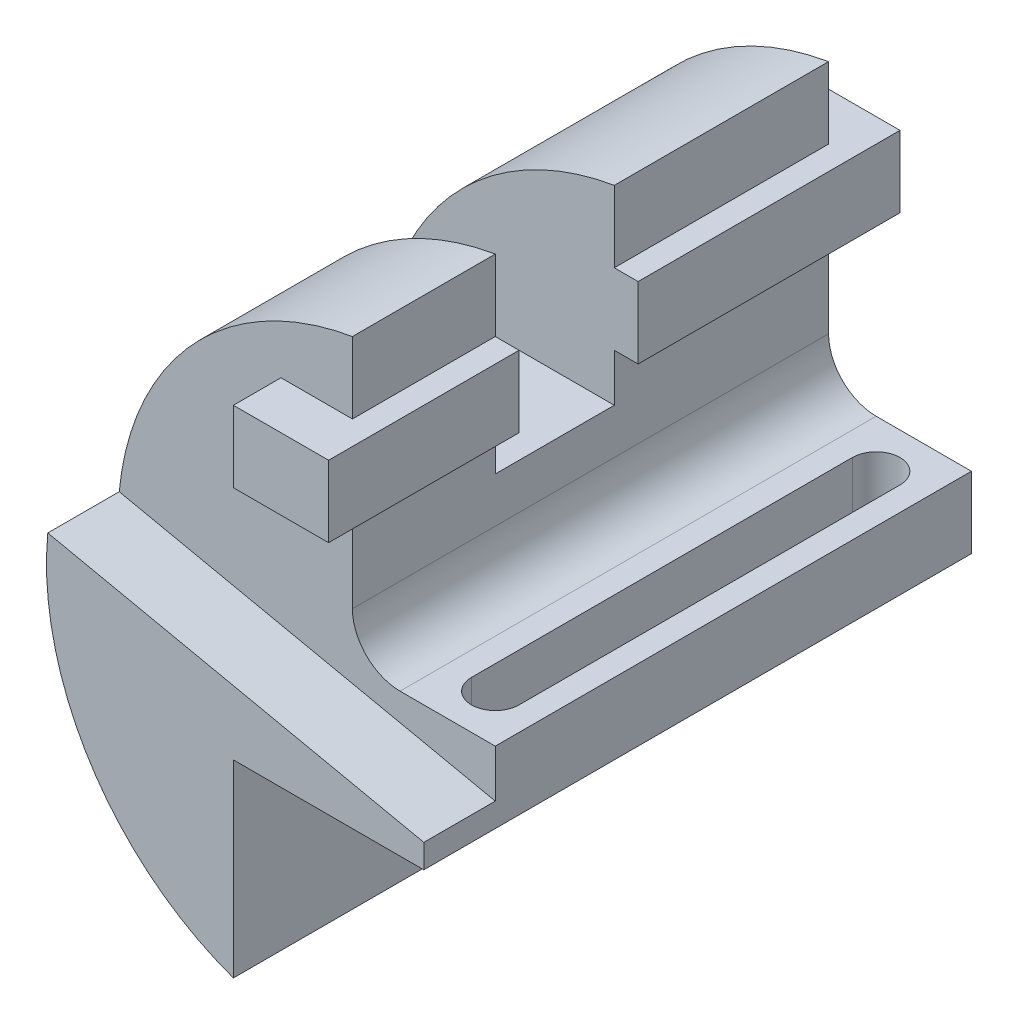
ISO-10303-21;
HEADER;
FILE_DESCRIPTION(('STEP AP214'),'2;1');
FILE_NAME('part.step','',(''),(''),'','','');
FILE_SCHEMA(('AUTOMOTIVE_DESIGN { 1 0 10303 214 1 1 1 1 }'));
ENDSEC;
DATA;
#1=APPLICATION_CONTEXT('core data for automotive mechanical design processes');
#2=APPLICATION_PROTOCOL_DEFINITION('international standard','automotive_design',2000,#1);
#3=PRODUCT_CONTEXT('',#1,'mechanical');
#4=PRODUCT('Part','Part','',(#3));
#5=PRODUCT_RELATED_PRODUCT_CATEGORY('part','',(#4));
#6=PRODUCT_DEFINITION_FORMATION('','',#4);
#7=PRODUCT_DEFINITION_CONTEXT('part definition',#1,'design');
#8=PRODUCT_DEFINITION('design','',#6,#7);
#9=PRODUCT_DEFINITION_SHAPE('','',#8);
#10=(LENGTH_UNIT() NAMED_UNIT(*) SI_UNIT(.MILLI.,.METRE.));
#11=(NAMED_UNIT(*) PLANE_ANGLE_UNIT() SI_UNIT($,.RADIAN.));
#12=(NAMED_UNIT(*) SI_UNIT($,.STERADIAN.) SOLID_ANGLE_UNIT());
#13=UNCERTAINTY_MEASURE_WITH_UNIT(LENGTH_MEASURE(1.E-05),#10,'distance_accuracy_value','');
#14=(GEOMETRIC_REPRESENTATION_CONTEXT(3) GLOBAL_UNCERTAINTY_ASSIGNED_CONTEXT((#13)) GLOBAL_UNIT_ASSIGNED_CONTEXT((#10,
#11,#12)) REPRESENTATION_CONTEXT('',''));
#15=CARTESIAN_POINT('',(0.,0.,0.));
#16=DIRECTION('',(0.,0.,1.));
#17=DIRECTION('',(1.,0.,0.));
#18=AXIS2_PLACEMENT_3D('',#15,#16,#17);
#19=CARTESIAN_POINT('',(-10.,58.4000214041057,115.));
#20=DIRECTION('',(-1.,0.,0.));
#21=DIRECTION('',(0.,-1.,0.));
#22=AXIS2_PLACEMENT_3D('',#19,#20,#21);
#23=PLANE('',#22);
#24=DIRECTION('',(0.,0.,-1.));
#25=VECTOR('',#24,1.);
#26=CARTESIAN_POINT('',(-10.,43.4000214041057,115.));
#27=LINE('',#26,#25);
#28=CARTESIAN_POINT('',(-9.99999999999999,43.4000214041057,100.));
#29=VERTEX_POINT('',#28);
#30=CARTESIAN_POINT('',(-9.99999999999999,43.4000214041057,70.));
#31=VERTEX_POINT('',#30);
#32=EDGE_CURVE('E370',#29,#31,#27,.T.);
#33=ORIENTED_EDGE('',*,*,#32,.T.);
#34=DIRECTION('',(0.,1.,0.));
#35=VECTOR('',#34,1.);
#36=CARTESIAN_POINT('',(-10.,58.4000214041057,70.));
#37=LINE('',#36,#35);
#38=CARTESIAN_POINT('',(-10.,58.4000214041057,70.));
#39=VERTEX_POINT('',#38);
#40=EDGE_CURVE('E301',#31,#39,#37,.T.);
#41=ORIENTED_EDGE('',*,*,#40,.T.);
#42=DIRECTION('',(0.,0.,-1.));
#43=VECTOR('',#42,1.);
#44=CARTESIAN_POINT('',(-10.,58.4000214041057,115.));
#45=LINE('',#44,#43);
#46=CARTESIAN_POINT('',(-9.99999999999999,58.4000214041057,100.));
#47=VERTEX_POINT('',#46);
#48=EDGE_CURVE('E452',#47,#39,#45,.T.);
#49=ORIENTED_EDGE('',*,*,#48,.F.);
#50=DIRECTION('',(0.,1.,0.));
#51=VECTOR('',#50,1.);
#52=CARTESIAN_POINT('',(-9.99999999999999,8.90002140410568,100.));
#53=LINE('',#52,#51);
#54=EDGE_CURVE('E390',#29,#47,#53,.T.);
#55=ORIENTED_EDGE('',*,*,#54,.F.);
#56=EDGE_LOOP('',(#33,#41,#49,#55));
#57=FACE_BOUND('',#56,.T.);
#58=ADVANCED_FACE('F44',(#57),#23,.F.);
#59=CARTESIAN_POINT('',(-25.,43.4000214041057,-45.));
#60=DIRECTION('',(0.,1.,0.));
#61=DIRECTION('',(0.,0.,1.));
#62=AXIS2_PLACEMENT_3D('',#59,#60,#61);
#63=PLANE('',#62);
#64=DIRECTION('',(1.,0.,0.));
#65=VECTOR('',#64,1.);
#66=CARTESIAN_POINT('',(-25.,43.4000214041057,70.));
#67=LINE('',#66,#65);
#68=CARTESIAN_POINT('',(-4.99999999999999,43.4000214041057,70.));
#69=VERTEX_POINT('',#68);
#70=EDGE_CURVE('E298',#31,#69,#67,.T.);
#71=ORIENTED_EDGE('',*,*,#70,.F.);
#72=ORIENTED_EDGE('',*,*,#32,.F.);
#73=DIRECTION('',(-1.,0.,0.));
#74=VECTOR('',#73,1.);
#75=CARTESIAN_POINT('',(0.,43.4000214041057,100.));
#76=LINE('',#75,#74);
#77=CARTESIAN_POINT('',(-25.,43.4000214041057,100.));
#78=VERTEX_POINT('',#77);
#79=EDGE_CURVE('E485',#29,#78,#76,.T.);
#80=ORIENTED_EDGE('',*,*,#79,.T.);
#81=DIRECTION('',(0.,0.,1.));
#82=VECTOR('',#81,1.);
#83=CARTESIAN_POINT('',(-25.,43.4000214041057,-45.));
#84=LINE('',#83,#82);
#85=CARTESIAN_POINT('',(-25.,43.4000214041057,110.));
#86=VERTEX_POINT('',#85);
#87=EDGE_CURVE('E344',#78,#86,#84,.T.);
#88=ORIENTED_EDGE('',*,*,#87,.T.);
#89=DIRECTION('',(-1.,0.,0.));
#90=VECTOR('',#89,1.);
#91=CARTESIAN_POINT('',(-25.,43.4000214041057,110.));
#92=LINE('',#91,#90);
#93=CARTESIAN_POINT('',(-4.99999999999999,43.4000214041057,110.));
#94=VERTEX_POINT('',#93);
#95=EDGE_CURVE('E336',#94,#86,#92,.T.);
#96=ORIENTED_EDGE('',*,*,#95,.F.);
#97=DIRECTION('',(0.,0.,1.));
#98=VECTOR('',#97,1.);
#99=CARTESIAN_POINT('',(-4.99999999999999,43.4000214041057,-45.));
#100=LINE('',#99,#98);
#101=EDGE_CURVE('E349',#69,#94,#100,.T.);
#102=ORIENTED_EDGE('',*,*,#101,.F.);
#103=EDGE_LOOP('',(#71,#72,#80,#88,#96,#102));
#104=FACE_BOUND('',#103,.T.);
#105=ADVANCED_FACE('F525',(#104),#63,.T.);
#106=CARTESIAN_POINT('',(-25.,28.4000214041057,-45.));
#107=DIRECTION('',(0.,-1.,0.));
#108=DIRECTION('',(0.,0.,-1.));
#109=AXIS2_PLACEMENT_3D('',#106,#107,#108);
#110=PLANE('',#109);
#111=DIRECTION('',(-1.,0.,0.));
#112=VECTOR('',#111,1.);
#113=CARTESIAN_POINT('',(-25.,28.4000214041057,70.));
#114=LINE('',#113,#112);
#115=CARTESIAN_POINT('',(-4.99999999999999,28.4000214041057,70.));
#116=VERTEX_POINT('',#115);
#117=CARTESIAN_POINT('',(-9.99999999999999,28.4000214041057,70.));
#118=VERTEX_POINT('',#117);
#119=EDGE_CURVE('E291',#116,#118,#114,.T.);
#120=ORIENTED_EDGE('',*,*,#119,.F.);
#121=DIRECTION('',(0.,0.,1.));
#122=VECTOR('',#121,1.);
#123=CARTESIAN_POINT('',(-4.99999999999999,28.4000214041057,-45.));
#124=LINE('',#123,#122);
#125=CARTESIAN_POINT('',(-4.99999999999999,28.4000214041057,110.));
#126=VERTEX_POINT('',#125);
#127=EDGE_CURVE('E354',#116,#126,#124,.T.);
#128=ORIENTED_EDGE('',*,*,#127,.T.);
#129=DIRECTION('',(1.,0.,0.));
#130=VECTOR('',#129,1.);
#131=CARTESIAN_POINT('',(-25.,28.4000214041057,110.));
#132=LINE('',#131,#130);
#133=CARTESIAN_POINT('',(-25.,28.4000214041057,110.));
#134=VERTEX_POINT('',#133);
#135=EDGE_CURVE('E328',#134,#126,#132,.T.);
#136=ORIENTED_EDGE('',*,*,#135,.F.);
#137=DIRECTION('',(0.,0.,1.));
#138=VECTOR('',#137,1.);
#139=CARTESIAN_POINT('',(-25.,28.4000214041057,-45.));
#140=LINE('',#139,#138);
#141=CARTESIAN_POINT('',(-25.,28.4000214041057,100.));
#142=VERTEX_POINT('',#141);
#143=EDGE_CURVE('E340',#142,#134,#140,.T.);
#144=ORIENTED_EDGE('',*,*,#143,.F.);
#145=DIRECTION('',(1.,0.,0.));
#146=VECTOR('',#145,1.);
#147=CARTESIAN_POINT('',(0.,28.4000214041057,100.));
#148=LINE('',#147,#146);
#149=CARTESIAN_POINT('',(-9.99999999999999,28.4000214041057,100.));
#150=VERTEX_POINT('',#149);
#151=EDGE_CURVE('E477',#142,#150,#148,.T.);
#152=ORIENTED_EDGE('',*,*,#151,.T.);
#153=DIRECTION('',(0.,0.,1.));
#154=VECTOR('',#153,1.);
#155=CARTESIAN_POINT('',(-9.99999999999999,28.4000214041057,115.));
#156=LINE('',#155,#154);
#157=EDGE_CURVE('E361',#118,#150,#156,.T.);
#158=ORIENTED_EDGE('',*,*,#157,.F.);
#159=EDGE_LOOP('',(#120,#128,#136,#144,#152,#158));
#160=FACE_BOUND('',#159,.T.);
#161=ADVANCED_FACE('F533',(#160),#110,.T.);
#162=CARTESIAN_POINT('',(-4.99999999999999,43.4000214041057,-45.));
#163=DIRECTION('',(1.,0.,0.));
#164=DIRECTION('',(0.,1.,0.));
#165=AXIS2_PLACEMENT_3D('',#162,#163,#164);
#166=PLANE('',#165);
#167=DIRECTION('',(0.,-1.,0.));
#168=VECTOR('',#167,1.);
#169=CARTESIAN_POINT('',(-4.99999999999999,43.4000214041057,70.));
#170=LINE('',#169,#168);
#171=EDGE_CURVE('E492',#69,#116,#170,.T.);
#172=ORIENTED_EDGE('',*,*,#171,.F.);
#173=ORIENTED_EDGE('',*,*,#101,.T.);
#174=DIRECTION('',(0.,1.,0.));
#175=VECTOR('',#174,1.);
#176=CARTESIAN_POINT('',(-4.99999999999999,43.4000214041057,110.));
#177=LINE('',#176,#175);
#178=EDGE_CURVE('E332',#126,#94,#177,.T.);
#179=ORIENTED_EDGE('',*,*,#178,.F.);
#180=ORIENTED_EDGE('',*,*,#127,.F.);
#181=EDGE_LOOP('',(#172,#173,#179,#180));
#182=FACE_BOUND('',#181,.T.);
#183=ADVANCED_FACE('F540',(#182),#166,.T.);
#184=CARTESIAN_POINT('',(-10.,58.4000214041057,45.));
#185=VERTEX_POINT('',#184);
#186=CARTESIAN_POINT('',(-10.,58.4000214041057,0.));
#187=VERTEX_POINT('',#186);
#188=EDGE_CURVE('E426',#185,#187,#45,.T.);
#189=ORIENTED_EDGE('',*,*,#188,.F.);
#190=DIRECTION('',(0.,-1.,0.));
#191=VECTOR('',#190,1.);
#192=CARTESIAN_POINT('',(-10.,58.4000214041057,45.));
#193=LINE('',#192,#191);
#194=CARTESIAN_POINT('',(-9.99999999999999,43.4000214041057,45.));
#195=VERTEX_POINT('',#194);
#196=EDGE_CURVE('E283',#185,#195,#193,.T.);
#197=ORIENTED_EDGE('',*,*,#196,.T.);
#198=CARTESIAN_POINT('',(-10.,43.4000214041057,0.));
#199=VERTEX_POINT('',#198);
#200=EDGE_CURVE('E369',#195,#199,#27,.T.);
#201=ORIENTED_EDGE('',*,*,#200,.T.);
#202=DIRECTION('',(0.,1.,0.));
#203=VECTOR('',#202,1.);
#204=CARTESIAN_POINT('',(-10.,58.4000214041057,0.));
#205=LINE('',#204,#203);
#206=EDGE_CURVE('E448',#199,#187,#205,.T.);
#207=ORIENTED_EDGE('',*,*,#206,.T.);
#208=EDGE_LOOP('',(#189,#197,#201,#207));
#209=FACE_BOUND('',#208,.T.);
#210=ADVANCED_FACE('F528',(#209),#23,.F.);
#211=CARTESIAN_POINT('',(0.,-1.09997859589433,115.));
#212=DIRECTION('',(0.,-1.,0.));
#213=DIRECTION('',(0.,0.,-1.));
#214=AXIS2_PLACEMENT_3D('',#211,#212,#213);
#215=PLANE('',#214);
#216=DIRECTION('',(0.,0.,1.));
#217=VECTOR('',#216,1.);
#218=CARTESIAN_POINT('',(5.00000000000004,-1.09997859589433,10.));
#219=LINE('',#218,#217);
#220=CARTESIAN_POINT('',(5.00000000000004,-1.09997859589433,10.));
#221=VERTEX_POINT('',#220);
#222=CARTESIAN_POINT('',(5.00000000000005,-1.09997859589433,90.));
#223=VERTEX_POINT('',#222);
#224=EDGE_CURVE('E243',#221,#223,#219,.T.);
#225=ORIENTED_EDGE('',*,*,#224,.F.);
#226=CARTESIAN_POINT('',(10.,-1.09997859589433,10.));
#227=DIRECTION('',(0.,1.,0.));
#228=DIRECTION('',(0.,0.,1.));
#229=AXIS2_PLACEMENT_3D('',#226,#227,#228);
#230=CIRCLE('',#229,5.);
#231=CARTESIAN_POINT('',(15.,-1.09997859589433,10.));
#232=VERTEX_POINT('',#231);
#233=EDGE_CURVE('E60',#232,#221,#230,.T.);
#234=ORIENTED_EDGE('',*,*,#233,.F.);
#235=DIRECTION('',(0.,0.,-1.));
#236=VECTOR('',#235,1.);
#237=CARTESIAN_POINT('',(15.,-1.09997859589433,10.));
#238=LINE('',#237,#236);
#239=CARTESIAN_POINT('',(15.,-1.09997859589433,90.));
#240=VERTEX_POINT('',#239);
#241=EDGE_CURVE('E251',#240,#232,#238,.T.);
#242=ORIENTED_EDGE('',*,*,#241,.F.);
#243=CARTESIAN_POINT('',(10.,-1.09997859589433,90.));
#244=DIRECTION('',(0.,1.,0.));
#245=DIRECTION('',(0.,0.,1.));
#246=AXIS2_PLACEMENT_3D('',#243,#244,#245);
#247=CIRCLE('',#246,4.99999999999999);
#248=EDGE_CURVE('E233',#223,#240,#247,.T.);
#249=ORIENTED_EDGE('',*,*,#248,.F.);
#250=EDGE_LOOP('',(#225,#234,#242,#249));
#251=FACE_BOUND('',#250,.T.);
#252=DIRECTION('',(-1.,0.,0.));
#253=VECTOR('',#252,1.);
#254=CARTESIAN_POINT('',(20.,-1.09997859589433,100.));
#255=LINE('',#254,#253);
#256=CARTESIAN_POINT('',(20.,-1.09997859589433,100.));
#257=VERTEX_POINT('',#256);
#258=CARTESIAN_POINT('',(0.,-1.09997859589433,100.));
#259=VERTEX_POINT('',#258);
#260=EDGE_CURVE('E384',#257,#259,#255,.T.);
#261=ORIENTED_EDGE('',*,*,#260,.F.);
#262=DIRECTION('',(0.,0.,-1.));
#263=VECTOR('',#262,1.);
#264=CARTESIAN_POINT('',(20.,-1.09997859589433,115.));
#265=LINE('',#264,#263);
#266=CARTESIAN_POINT('',(20.,-1.09997859589433,0.));
#267=VERTEX_POINT('',#266);
#268=EDGE_CURVE('E462',#257,#267,#265,.T.);
#269=ORIENTED_EDGE('',*,*,#268,.T.);
#270=DIRECTION('',(-1.,0.,0.));
#271=VECTOR('',#270,1.);
#272=CARTESIAN_POINT('',(0.,-1.09997859589433,0.));
#273=LINE('',#272,#271);
#274=CARTESIAN_POINT('',(0.,-1.09997859589433,0.));
#275=VERTEX_POINT('',#274);
#276=EDGE_CURVE('E440',#267,#275,#273,.T.);
#277=ORIENTED_EDGE('',*,*,#276,.T.);
#278=DIRECTION('',(0.,0.,-1.));
#279=VECTOR('',#278,1.);
#280=CARTESIAN_POINT('',(0.,-1.09997859589433,115.));
#281=LINE('',#280,#279);
#282=EDGE_CURVE('E459',#259,#275,#281,.T.);
#283=ORIENTED_EDGE('',*,*,#282,.F.);
#284=EDGE_LOOP('',(#261,#269,#277,#283));
#285=FACE_BOUND('',#284,.T.);
#286=ADVANCED_FACE('F248',(#251,#285),#215,.F.);
#287=CARTESIAN_POINT('',(0.,8.90002140410567,115.));
#288=DIRECTION('',(0.,0.,-1.));
#289=DIRECTION('',(-1.,0.,0.));
#290=AXIS2_PLACEMENT_3D('',#287,#288,#289);
#291=CYLINDRICAL_SURFACE('',#290,10.);
#292=CARTESIAN_POINT('',(0.,8.90002140410567,100.));
#293=DIRECTION('',(0.,0.,-1.));
#294=DIRECTION('',(1.,0.,0.));
#295=AXIS2_PLACEMENT_3D('',#292,#293,#294);
#296=CIRCLE('',#295,10.);
#297=CARTESIAN_POINT('',(-9.99999999999999,8.90002140410568,100.));
#298=VERTEX_POINT('',#297);
#299=EDGE_CURVE('E387',#259,#298,#296,.T.);
#300=ORIENTED_EDGE('',*,*,#299,.F.);
#301=ORIENTED_EDGE('',*,*,#282,.T.);
#302=CARTESIAN_POINT('',(0.,8.90002140410567,0.));
#303=DIRECTION('',(0.,0.,-1.));
#304=DIRECTION('',(1.,0.,0.));
#305=AXIS2_PLACEMENT_3D('',#302,#303,#304);
#306=CIRCLE('',#305,10.);
#307=CARTESIAN_POINT('',(-9.99999999999999,8.90002140410567,0.));
#308=VERTEX_POINT('',#307);
#309=EDGE_CURVE('E444',#275,#308,#306,.T.);
#310=ORIENTED_EDGE('',*,*,#309,.T.);
#311=DIRECTION('',(0.,0.,-1.));
#312=VECTOR('',#311,1.);
#313=CARTESIAN_POINT('',(-9.99999999999999,8.90002140410567,115.));
#314=LINE('',#313,#312);
#315=EDGE_CURVE('E456',#298,#308,#314,.T.);
#316=ORIENTED_EDGE('',*,*,#315,.F.);
#317=EDGE_LOOP('',(#300,#301,#310,#316));
#318=FACE_BOUND('',#317,.T.);
#319=ADVANCED_FACE('F543',(#318),#291,.F.);
#320=DIRECTION('',(0.,0.,1.));
#321=VECTOR('',#320,1.);
#322=CARTESIAN_POINT('',(-9.99999999999999,18.4000214041057,115.));
#323=LINE('',#322,#321);
#324=CARTESIAN_POINT('',(-9.99999999999999,18.4000214041057,45.));
#325=VERTEX_POINT('',#324);
#326=CARTESIAN_POINT('',(-9.99999999999999,18.4000214041057,70.));
#327=VERTEX_POINT('',#326);
#328=EDGE_CURVE('E309',#325,#327,#323,.T.);
#329=ORIENTED_EDGE('',*,*,#328,.T.);
#330=DIRECTION('',(0.,1.,0.));
#331=VECTOR('',#330,1.);
#332=CARTESIAN_POINT('',(-10.,58.4000214041057,70.));
#333=LINE('',#332,#331);
#334=EDGE_CURVE('E294',#327,#118,#333,.T.);
#335=ORIENTED_EDGE('',*,*,#334,.T.);
#336=ORIENTED_EDGE('',*,*,#157,.T.);
#337=EDGE_CURVE('E391',#298,#150,#53,.T.);
#338=ORIENTED_EDGE('',*,*,#337,.F.);
#339=ORIENTED_EDGE('',*,*,#315,.T.);
#340=CARTESIAN_POINT('',(-9.99999999999999,28.4000214041057,0.));
#341=VERTEX_POINT('',#340);
#342=EDGE_CURVE('E416',#308,#341,#205,.T.);
#343=ORIENTED_EDGE('',*,*,#342,.T.);
#344=CARTESIAN_POINT('',(-9.99999999999999,28.4000214041057,45.));
#345=VERTEX_POINT('',#344);
#346=EDGE_CURVE('E362',#341,#345,#156,.T.);
#347=ORIENTED_EDGE('',*,*,#346,.T.);
#348=DIRECTION('',(0.,-1.,0.));
#349=VECTOR('',#348,1.);
#350=CARTESIAN_POINT('',(-10.,58.4000214041057,45.));
#351=LINE('',#350,#349);
#352=EDGE_CURVE('E276',#345,#325,#351,.T.);
#353=ORIENTED_EDGE('',*,*,#352,.T.);
#354=EDGE_LOOP('',(#329,#335,#336,#338,#339,#343,#347,#353));
#355=FACE_BOUND('',#354,.T.);
#356=ADVANCED_FACE('F529',(#355),#23,.F.);
#357=CARTESIAN_POINT('',(0.,0.,115.));
#358=DIRECTION('',(0.,0.,-1.));
#359=DIRECTION('',(-1.,0.,0.));
#360=AXIS2_PLACEMENT_3D('',#357,#358,#359);
#361=CYLINDRICAL_SURFACE('',#360,59.25);
#362=ORIENTED_EDGE('',*,*,#48,.T.);
#363=CARTESIAN_POINT('',(0.,0.,70.));
#364=DIRECTION('',(0.,0.,1.));
#365=DIRECTION('',(0.,-1.,0.));
#366=AXIS2_PLACEMENT_3D('',#363,#364,#365);
#367=CIRCLE('',#366,59.25);
#368=CARTESIAN_POINT('',(-56.3205265629544,18.4000214041056,70.));
#369=VERTEX_POINT('',#368);
#370=EDGE_CURVE('E305',#39,#369,#367,.T.);
#371=ORIENTED_EDGE('',*,*,#370,.T.);
#372=DIRECTION('',(0.,0.,-1.));
#373=VECTOR('',#372,1.);
#374=CARTESIAN_POINT('',(-56.3205265629544,18.4000214041056,115.));
#375=LINE('',#374,#373);
#376=CARTESIAN_POINT('',(-56.3205265629544,18.4000214041056,45.));
#377=VERTEX_POINT('',#376);
#378=EDGE_CURVE('E495',#369,#377,#375,.T.);
#379=ORIENTED_EDGE('',*,*,#378,.T.);
#380=CARTESIAN_POINT('',(0.,0.,45.));
#381=DIRECTION('',(0.,0.,-1.));
#382=DIRECTION('',(0.,1.,0.));
#383=AXIS2_PLACEMENT_3D('',#380,#381,#382);
#384=CIRCLE('',#383,59.25);
#385=EDGE_CURVE('E287',#377,#185,#384,.T.);
#386=ORIENTED_EDGE('',*,*,#385,.T.);
#387=ORIENTED_EDGE('',*,*,#188,.T.);
#388=CARTESIAN_POINT('',(0.,0.,0.));
#389=DIRECTION('',(0.,0.,1.));
#390=DIRECTION('',(1.,0.,0.));
#391=AXIS2_PLACEMENT_3D('',#388,#389,#390);
#392=CIRCLE('',#391,59.25);
#393=CARTESIAN_POINT('',(-20.,-55.7724170177338,0.));
#394=VERTEX_POINT('',#393);
#395=EDGE_CURVE('E409',#187,#394,#392,.T.);
#396=ORIENTED_EDGE('',*,*,#395,.T.);
#397=DIRECTION('',(0.,0.,-1.));
#398=VECTOR('',#397,1.);
#399=CARTESIAN_POINT('',(-20.,-55.7724170177338,115.));
#400=LINE('',#399,#398);
#401=CARTESIAN_POINT('',(-20.,-55.7724170177338,115.));
#402=VERTEX_POINT('',#401);
#403=EDGE_CURVE('E473',#402,#394,#400,.T.);
#404=ORIENTED_EDGE('',*,*,#403,.F.);
#405=CARTESIAN_POINT('',(0.,0.,115.));
#406=DIRECTION('',(0.,0.,1.));
#407=DIRECTION('',(1.,0.,0.));
#408=AXIS2_PLACEMENT_3D('',#405,#406,#407);
#409=CIRCLE('',#408,59.25);
#410=CARTESIAN_POINT('',(-58.9764421708089,5.68698240486387,115.));
#411=VERTEX_POINT('',#410);
#412=EDGE_CURVE('E412',#411,#402,#409,.T.);
#413=ORIENTED_EDGE('',*,*,#412,.F.);
#414=DIRECTION('',(0.,0.,1.));
#415=VECTOR('',#414,1.);
#416=CARTESIAN_POINT('',(-58.9764421708089,5.68698240486387,100.));
#417=LINE('',#416,#415);
#418=CARTESIAN_POINT('',(-58.9764421708089,5.68698240486387,100.));
#419=VERTEX_POINT('',#418);
#420=EDGE_CURVE('E402',#419,#411,#417,.T.);
#421=ORIENTED_EDGE('',*,*,#420,.F.);
#422=CARTESIAN_POINT('',(0.,0.,100.));
#423=DIRECTION('',(0.,0.,1.));
#424=DIRECTION('',(1.,0.,0.));
#425=AXIS2_PLACEMENT_3D('',#422,#423,#424);
#426=CIRCLE('',#425,59.25);
#427=EDGE_CURVE('E395',#47,#419,#426,.T.);
#428=ORIENTED_EDGE('',*,*,#427,.F.);
#429=EDGE_LOOP('',(#362,#371,#379,#386,#387,#396,#404,#413,#421,#428));
#430=FACE_BOUND('',#429,.T.);
#431=ADVANCED_FACE('F46',(#430),#361,.T.);
#432=CARTESIAN_POINT('',(-20.,-16.0999785958943,115.));
#433=DIRECTION('',(-1.,0.,0.));
#434=DIRECTION('',(0.,-1.,0.));
#435=AXIS2_PLACEMENT_3D('',#432,#433,#434);
#436=PLANE('',#435);
#437=DIRECTION('',(0.,1.,0.));
#438=VECTOR('',#437,1.);
#439=CARTESIAN_POINT('',(-20.,-16.0999785958943,0.));
#440=LINE('',#439,#438);
#441=CARTESIAN_POINT('',(-20.,-16.0999785958943,0.));
#442=VERTEX_POINT('',#441);
#443=EDGE_CURVE('E430',#394,#442,#440,.T.);
#444=ORIENTED_EDGE('',*,*,#443,.T.);
#445=DIRECTION('',(0.,0.,-1.));
#446=VECTOR('',#445,1.);
#447=CARTESIAN_POINT('',(-20.,-16.0999785958943,115.));
#448=LINE('',#447,#446);
#449=CARTESIAN_POINT('',(-20.,-16.0999785958943,115.));
#450=VERTEX_POINT('',#449);
#451=EDGE_CURVE('E469',#450,#442,#448,.T.);
#452=ORIENTED_EDGE('',*,*,#451,.F.);
#453=DIRECTION('',(0.,1.,0.));
#454=VECTOR('',#453,1.);
#455=CARTESIAN_POINT('',(-20.,-16.0999785958943,115.));
#456=LINE('',#455,#454);
#457=EDGE_CURVE('E415',#402,#450,#456,.T.);
#458=ORIENTED_EDGE('',*,*,#457,.F.);
#459=ORIENTED_EDGE('',*,*,#403,.T.);
#460=EDGE_LOOP('',(#444,#452,#458,#459));
#461=FACE_BOUND('',#460,.T.);
#462=ADVANCED_FACE('F549',(#461),#436,.F.);
#463=CARTESIAN_POINT('',(20.,-16.0999785958943,115.));
#464=DIRECTION('',(0.,1.,0.));
#465=DIRECTION('',(-1.,0.,0.));
#466=AXIS2_PLACEMENT_3D('',#463,#464,#465);
#467=PLANE('',#466);
#468=DIRECTION('',(0.,0.,-1.));
#469=VECTOR('',#468,1.);
#470=CARTESIAN_POINT('',(15.,-16.0999785958943,115.));
#471=LINE('',#470,#469);
#472=CARTESIAN_POINT('',(15.,-16.0999785958943,90.));
#473=VERTEX_POINT('',#472);
#474=CARTESIAN_POINT('',(15.,-16.0999785958943,10.));
#475=VERTEX_POINT('',#474);
#476=EDGE_CURVE('E53',#473,#475,#471,.T.);
#477=ORIENTED_EDGE('',*,*,#476,.T.);
#478=CARTESIAN_POINT('',(10.,-16.0999785958943,10.));
#479=DIRECTION('',(0.,1.,0.));
#480=DIRECTION('',(-1.,0.,0.));
#481=AXIS2_PLACEMENT_3D('',#478,#479,#480);
#482=CIRCLE('',#481,5.);
#483=CARTESIAN_POINT('',(5.00000000000004,-16.0999785958943,10.));
#484=VERTEX_POINT('',#483);
#485=EDGE_CURVE('E12',#475,#484,#482,.T.);
#486=ORIENTED_EDGE('',*,*,#485,.T.);
#487=DIRECTION('',(0.,0.,1.));
#488=VECTOR('',#487,1.);
#489=CARTESIAN_POINT('',(5.00000000000005,-16.0999785958943,115.));
#490=LINE('',#489,#488);
#491=CARTESIAN_POINT('',(5.00000000000005,-16.0999785958943,90.));
#492=VERTEX_POINT('',#491);
#493=EDGE_CURVE('E499',#484,#492,#490,.T.);
#494=ORIENTED_EDGE('',*,*,#493,.T.);
#495=CARTESIAN_POINT('',(10.,-16.0999785958943,90.));
#496=DIRECTION('',(0.,1.,0.));
#497=DIRECTION('',(-1.,0.,0.));
#498=AXIS2_PLACEMENT_3D('',#495,#496,#497);
#499=CIRCLE('',#498,4.99999999999999);
#500=EDGE_CURVE('E236',#492,#473,#499,.T.);
#501=ORIENTED_EDGE('',*,*,#500,.T.);
#502=EDGE_LOOP('',(#477,#486,#494,#501));
#503=FACE_BOUND('',#502,.T.);
#504=DIRECTION('',(1.,0.,0.));
#505=VECTOR('',#504,1.);
#506=CARTESIAN_POINT('',(20.,-16.0999785958943,0.));
#507=LINE('',#506,#505);
#508=CARTESIAN_POINT('',(20.,-16.0999785958943,0.));
#509=VERTEX_POINT('',#508);
#510=EDGE_CURVE('E433',#442,#509,#507,.T.);
#511=ORIENTED_EDGE('',*,*,#510,.T.);
#512=DIRECTION('',(0.,0.,-1.));
#513=VECTOR('',#512,1.);
#514=CARTESIAN_POINT('',(20.,-16.0999785958943,115.));
#515=LINE('',#514,#513);
#516=CARTESIAN_POINT('',(20.,-16.0999785958943,115.));
#517=VERTEX_POINT('',#516);
#518=EDGE_CURVE('E465',#517,#509,#515,.T.);
#519=ORIENTED_EDGE('',*,*,#518,.F.);
#520=DIRECTION('',(1.,0.,0.));
#521=VECTOR('',#520,1.);
#522=CARTESIAN_POINT('',(20.,-16.0999785958943,115.));
#523=LINE('',#522,#521);
#524=EDGE_CURVE('E419',#450,#517,#523,.T.);
#525=ORIENTED_EDGE('',*,*,#524,.F.);
#526=ORIENTED_EDGE('',*,*,#451,.T.);
#527=EDGE_LOOP('',(#511,#519,#525,#526));
#528=FACE_BOUND('',#527,.T.);
#529=ADVANCED_FACE('F506',(#503,#528),#467,.F.);
#530=CARTESIAN_POINT('',(20.,-1.09997859589433,115.));
#531=DIRECTION('',(-1.,0.,0.));
#532=DIRECTION('',(0.,-1.,0.));
#533=AXIS2_PLACEMENT_3D('',#530,#531,#532);
#534=PLANE('',#533);
#535=DIRECTION('',(0.,1.,0.));
#536=VECTOR('',#535,1.);
#537=CARTESIAN_POINT('',(20.,-11.0999785958943,100.));
#538=LINE('',#537,#536);
#539=CARTESIAN_POINT('',(20.,-11.0999785958943,100.));
#540=VERTEX_POINT('',#539);
#541=EDGE_CURVE('E381',#540,#257,#538,.T.);
#542=ORIENTED_EDGE('',*,*,#541,.F.);
#543=DIRECTION('',(0.,0.,1.));
#544=VECTOR('',#543,1.);
#545=CARTESIAN_POINT('',(20.,-11.0999785958943,100.));
#546=LINE('',#545,#544);
#547=CARTESIAN_POINT('',(20.,-11.0999785958943,115.));
#548=VERTEX_POINT('',#547);
#549=EDGE_CURVE('E405',#540,#548,#546,.T.);
#550=ORIENTED_EDGE('',*,*,#549,.T.);
#551=DIRECTION('',(0.,1.,0.));
#552=VECTOR('',#551,1.);
#553=CARTESIAN_POINT('',(20.,-1.09997859589433,115.));
#554=LINE('',#553,#552);
#555=EDGE_CURVE('E422',#517,#548,#554,.T.);
#556=ORIENTED_EDGE('',*,*,#555,.F.);
#557=ORIENTED_EDGE('',*,*,#518,.T.);
#558=DIRECTION('',(0.,1.,0.));
#559=VECTOR('',#558,1.);
#560=CARTESIAN_POINT('',(20.,-1.09997859589433,0.));
#561=LINE('',#560,#559);
#562=EDGE_CURVE('E436',#509,#267,#561,.T.);
#563=ORIENTED_EDGE('',*,*,#562,.T.);
#564=ORIENTED_EDGE('',*,*,#268,.F.);
#565=EDGE_LOOP('',(#542,#550,#556,#557,#563,#564));
#566=FACE_BOUND('',#565,.T.);
#567=ADVANCED_FACE('F602',(#566),#534,.F.);
#568=CARTESIAN_POINT('',(0.,0.,115.));
#569=DIRECTION('',(0.,0.,1.));
#570=DIRECTION('',(1.,0.,0.));
#571=AXIS2_PLACEMENT_3D('',#568,#569,#570);
#572=PLANE('',#571);
#573=DIRECTION('',(0.978147600733806,-0.207911690817756,0.));
#574=VECTOR('',#573,1.);
#575=CARTESIAN_POINT('',(20.,-11.0999785958943,115.));
#576=LINE('',#575,#574);
#577=EDGE_CURVE('E380',#411,#548,#576,.T.);
#578=ORIENTED_EDGE('',*,*,#577,.F.);
#579=ORIENTED_EDGE('',*,*,#412,.T.);
#580=ORIENTED_EDGE('',*,*,#457,.T.);
#581=ORIENTED_EDGE('',*,*,#524,.T.);
#582=ORIENTED_EDGE('',*,*,#555,.T.);
#583=EDGE_LOOP('',(#578,#579,#580,#581,#582));
#584=FACE_BOUND('',#583,.T.);
#585=ADVANCED_FACE('F605',(#584),#572,.T.);
#586=CARTESIAN_POINT('',(0.,0.,0.));
#587=DIRECTION('',(0.,0.,1.));
#588=DIRECTION('',(1.,0.,0.));
#589=AXIS2_PLACEMENT_3D('',#586,#587,#588);
#590=PLANE('',#589);
#591=ORIENTED_EDGE('',*,*,#206,.F.);
#592=DIRECTION('',(-1.,0.,0.));
#593=VECTOR('',#592,1.);
#594=CARTESIAN_POINT('',(0.,43.4000214041057,0.));
#595=LINE('',#594,#593);
#596=CARTESIAN_POINT('',(-25.,43.4000214041057,0.));
#597=VERTEX_POINT('',#596);
#598=EDGE_CURVE('E374',#199,#597,#595,.T.);
#599=ORIENTED_EDGE('',*,*,#598,.T.);
#600=DIRECTION('',(0.,-1.,0.));
#601=VECTOR('',#600,1.);
#602=CARTESIAN_POINT('',(-25.,0.,0.));
#603=LINE('',#602,#601);
#604=CARTESIAN_POINT('',(-25.,28.4000214041057,0.));
#605=VERTEX_POINT('',#604);
#606=EDGE_CURVE('E377',#597,#605,#603,.T.);
#607=ORIENTED_EDGE('',*,*,#606,.T.);
#608=DIRECTION('',(1.,0.,0.));
#609=VECTOR('',#608,1.);
#610=CARTESIAN_POINT('',(0.,28.4000214041057,0.));
#611=LINE('',#610,#609);
#612=EDGE_CURVE('E366',#605,#341,#611,.T.);
#613=ORIENTED_EDGE('',*,*,#612,.T.);
#614=ORIENTED_EDGE('',*,*,#342,.F.);
#615=ORIENTED_EDGE('',*,*,#309,.F.);
#616=ORIENTED_EDGE('',*,*,#276,.F.);
#617=ORIENTED_EDGE('',*,*,#562,.F.);
#618=ORIENTED_EDGE('',*,*,#510,.F.);
#619=ORIENTED_EDGE('',*,*,#443,.F.);
#620=ORIENTED_EDGE('',*,*,#395,.F.);
#621=EDGE_LOOP('',(#591,#599,#607,#613,#614,#615,#616,#617,#618,#619,#620));
#622=FACE_BOUND('',#621,.T.);
#623=ADVANCED_FACE('F614',(#622),#590,.F.);
#624=CARTESIAN_POINT('',(20.,-11.0999785958943,100.));
#625=DIRECTION('',(-0.207911690817756,-0.978147600733806,0.));
#626=DIRECTION('',(0.978147600733806,-0.207911690817756,0.));
#627=AXIS2_PLACEMENT_3D('',#624,#625,#626);
#628=PLANE('',#627);
#629=ORIENTED_EDGE('',*,*,#577,.T.);
#630=ORIENTED_EDGE('',*,*,#549,.F.);
#631=DIRECTION('',(0.978147600733806,-0.207911690817756,0.));
#632=VECTOR('',#631,1.);
#633=CARTESIAN_POINT('',(20.,-11.0999785958943,100.));
#634=LINE('',#633,#632);
#635=EDGE_CURVE('E398',#419,#540,#634,.T.);
#636=ORIENTED_EDGE('',*,*,#635,.F.);
#637=ORIENTED_EDGE('',*,*,#420,.T.);
#638=EDGE_LOOP('',(#629,#630,#636,#637));
#639=FACE_BOUND('',#638,.T.);
#640=ADVANCED_FACE('F598',(#639),#628,.F.);
#641=CARTESIAN_POINT('',(0.,8.90002140410567,100.));
#642=DIRECTION('',(0.,0.,1.));
#643=DIRECTION('',(1.,0.,0.));
#644=AXIS2_PLACEMENT_3D('',#641,#642,#643);
#645=PLANE('',#644);
#646=ORIENTED_EDGE('',*,*,#79,.F.);
#647=ORIENTED_EDGE('',*,*,#54,.T.);
#648=ORIENTED_EDGE('',*,*,#427,.T.);
#649=ORIENTED_EDGE('',*,*,#635,.T.);
#650=ORIENTED_EDGE('',*,*,#541,.T.);
#651=ORIENTED_EDGE('',*,*,#260,.T.);
#652=ORIENTED_EDGE('',*,*,#299,.T.);
#653=ORIENTED_EDGE('',*,*,#337,.T.);
#654=ORIENTED_EDGE('',*,*,#151,.F.);
#655=DIRECTION('',(0.,-1.,0.));
#656=VECTOR('',#655,1.);
#657=CARTESIAN_POINT('',(-25.,8.90002140410567,100.));
#658=LINE('',#657,#656);
#659=EDGE_CURVE('E481',#78,#142,#658,.T.);
#660=ORIENTED_EDGE('',*,*,#659,.F.);
#661=EDGE_LOOP('',(#646,#647,#648,#649,#650,#651,#652,#653,#654,#660));
#662=FACE_BOUND('',#661,.T.);
#663=ADVANCED_FACE('F590',(#662),#645,.T.);
#664=CARTESIAN_POINT('',(-25.,43.4000214041057,-45.));
#665=DIRECTION('',(-1.,0.,0.));
#666=DIRECTION('',(0.,-1.,0.));
#667=AXIS2_PLACEMENT_3D('',#664,#665,#666);
#668=PLANE('',#667);
#669=ORIENTED_EDGE('',*,*,#606,.F.);
#670=CARTESIAN_POINT('',(-25.,43.4000214041057,-10.));
#671=VERTEX_POINT('',#670);
#672=EDGE_CURVE('E318',#671,#597,#84,.T.);
#673=ORIENTED_EDGE('',*,*,#672,.F.);
#674=DIRECTION('',(0.,1.,0.));
#675=VECTOR('',#674,1.);
#676=CARTESIAN_POINT('',(-25.,43.4000214041057,-10.));
#677=LINE('',#676,#675);
#678=CARTESIAN_POINT('',(-25.,28.4000214041057,-10.));
#679=VERTEX_POINT('',#678);
#680=EDGE_CURVE('E321',#679,#671,#677,.T.);
#681=ORIENTED_EDGE('',*,*,#680,.F.);
#682=EDGE_CURVE('E355',#679,#605,#140,.T.);
#683=ORIENTED_EDGE('',*,*,#682,.T.);
#684=EDGE_LOOP('',(#669,#673,#681,#683));
#685=FACE_BOUND('',#684,.T.);
#686=ADVANCED_FACE('F642',(#685),#668,.T.);
#687=DIRECTION('',(-1.,0.,0.));
#688=VECTOR('',#687,1.);
#689=CARTESIAN_POINT('',(-25.,43.4000214041057,45.));
#690=LINE('',#689,#688);
#691=CARTESIAN_POINT('',(-4.99999999999999,43.4000214041057,45.));
#692=VERTEX_POINT('',#691);
#693=EDGE_CURVE('E280',#692,#195,#690,.T.);
#694=ORIENTED_EDGE('',*,*,#693,.F.);
#695=CARTESIAN_POINT('',(-4.99999999999999,43.4000214041057,-10.));
#696=VERTEX_POINT('',#695);
#697=EDGE_CURVE('E345',#696,#692,#100,.T.);
#698=ORIENTED_EDGE('',*,*,#697,.F.);
#699=DIRECTION('',(1.,0.,0.));
#700=VECTOR('',#699,1.);
#701=CARTESIAN_POINT('',(-25.,43.4000214041057,-10.));
#702=LINE('',#701,#700);
#703=EDGE_CURVE('E317',#671,#696,#702,.T.);
#704=ORIENTED_EDGE('',*,*,#703,.F.);
#705=ORIENTED_EDGE('',*,*,#672,.T.);
#706=ORIENTED_EDGE('',*,*,#598,.F.);
#707=ORIENTED_EDGE('',*,*,#200,.F.);
#708=EDGE_LOOP('',(#694,#698,#704,#705,#706,#707));
#709=FACE_BOUND('',#708,.T.);
#710=ADVANCED_FACE('F536',(#709),#63,.T.);
#711=DIRECTION('',(1.,0.,0.));
#712=VECTOR('',#711,1.);
#713=CARTESIAN_POINT('',(-25.,28.4000214041057,45.));
#714=LINE('',#713,#712);
#715=CARTESIAN_POINT('',(-4.99999999999999,28.4000214041057,45.));
#716=VERTEX_POINT('',#715);
#717=EDGE_CURVE('E270',#345,#716,#714,.T.);
#718=ORIENTED_EDGE('',*,*,#717,.F.);
#719=ORIENTED_EDGE('',*,*,#346,.F.);
#720=ORIENTED_EDGE('',*,*,#612,.F.);
#721=ORIENTED_EDGE('',*,*,#682,.F.);
#722=DIRECTION('',(-1.,0.,0.));
#723=VECTOR('',#722,1.);
#724=CARTESIAN_POINT('',(-25.,28.4000214041057,-10.));
#725=LINE('',#724,#723);
#726=CARTESIAN_POINT('',(-4.99999999999999,28.4000214041057,-10.));
#727=VERTEX_POINT('',#726);
#728=EDGE_CURVE('E324',#727,#679,#725,.T.);
#729=ORIENTED_EDGE('',*,*,#728,.F.);
#730=EDGE_CURVE('E350',#727,#716,#124,.T.);
#731=ORIENTED_EDGE('',*,*,#730,.T.);
#732=EDGE_LOOP('',(#718,#719,#720,#721,#729,#731));
#733=FACE_BOUND('',#732,.T.);
#734=ADVANCED_FACE('F641',(#733),#110,.T.);
#735=ORIENTED_EDGE('',*,*,#87,.F.);
#736=ORIENTED_EDGE('',*,*,#659,.T.);
#737=ORIENTED_EDGE('',*,*,#143,.T.);
#738=DIRECTION('',(0.,-1.,0.));
#739=VECTOR('',#738,1.);
#740=CARTESIAN_POINT('',(-25.,43.4000214041057,110.));
#741=LINE('',#740,#739);
#742=EDGE_CURVE('E313',#86,#134,#741,.T.);
#743=ORIENTED_EDGE('',*,*,#742,.F.);
#744=EDGE_LOOP('',(#735,#736,#737,#743));
#745=FACE_BOUND('',#744,.T.);
#746=ADVANCED_FACE('F577',(#745),#668,.T.);
#747=DIRECTION('',(0.,1.,0.));
#748=VECTOR('',#747,1.);
#749=CARTESIAN_POINT('',(-4.99999999999999,43.4000214041057,45.));
#750=LINE('',#749,#748);
#751=EDGE_CURVE('E489',#716,#692,#750,.T.);
#752=ORIENTED_EDGE('',*,*,#751,.F.);
#753=ORIENTED_EDGE('',*,*,#730,.F.);
#754=DIRECTION('',(0.,-1.,0.));
#755=VECTOR('',#754,1.);
#756=CARTESIAN_POINT('',(-4.99999999999999,43.4000214041057,-10.));
#757=LINE('',#756,#755);
#758=EDGE_CURVE('E314',#696,#727,#757,.T.);
#759=ORIENTED_EDGE('',*,*,#758,.F.);
#760=ORIENTED_EDGE('',*,*,#697,.T.);
#761=EDGE_LOOP('',(#752,#753,#759,#760));
#762=FACE_BOUND('',#761,.T.);
#763=ADVANCED_FACE('F638',(#762),#166,.T.);
#764=CARTESIAN_POINT('',(0.,0.,110.));
#765=DIRECTION('',(0.,0.,1.));
#766=DIRECTION('',(1.,0.,0.));
#767=AXIS2_PLACEMENT_3D('',#764,#765,#766);
#768=PLANE('',#767);
#769=ORIENTED_EDGE('',*,*,#742,.T.);
#770=ORIENTED_EDGE('',*,*,#135,.T.);
#771=ORIENTED_EDGE('',*,*,#178,.T.);
#772=ORIENTED_EDGE('',*,*,#95,.T.);
#773=EDGE_LOOP('',(#769,#770,#771,#772));
#774=FACE_BOUND('',#773,.T.);
#775=ADVANCED_FACE('F583',(#774),#768,.T.);
#776=CARTESIAN_POINT('',(0.,0.,-10.));
#777=DIRECTION('',(0.,0.,1.));
#778=DIRECTION('',(1.,0.,0.));
#779=AXIS2_PLACEMENT_3D('',#776,#777,#778);
#780=PLANE('',#779);
#781=ORIENTED_EDGE('',*,*,#680,.T.);
#782=ORIENTED_EDGE('',*,*,#703,.T.);
#783=ORIENTED_EDGE('',*,*,#758,.T.);
#784=ORIENTED_EDGE('',*,*,#728,.T.);
#785=EDGE_LOOP('',(#781,#782,#783,#784));
#786=FACE_BOUND('',#785,.T.);
#787=ADVANCED_FACE('F631',(#786),#780,.F.);
#788=CARTESIAN_POINT('',(-59.25,18.4000214041056,70.));
#789=DIRECTION('',(0.,-1.,0.));
#790=DIRECTION('',(1.,0.,0.));
#791=AXIS2_PLACEMENT_3D('',#788,#789,#790);
#792=PLANE('',#791);
#793=DIRECTION('',(1.,0.,0.));
#794=VECTOR('',#793,1.);
#795=CARTESIAN_POINT('',(-59.25,18.4000214041056,45.));
#796=LINE('',#795,#794);
#797=EDGE_CURVE('E266',#377,#325,#796,.T.);
#798=ORIENTED_EDGE('',*,*,#797,.F.);
#799=ORIENTED_EDGE('',*,*,#378,.F.);
#800=DIRECTION('',(1.,0.,0.));
#801=VECTOR('',#800,1.);
#802=CARTESIAN_POINT('',(-59.25,18.4000214041056,70.));
#803=LINE('',#802,#801);
#804=EDGE_CURVE('E261',#369,#327,#803,.T.);
#805=ORIENTED_EDGE('',*,*,#804,.T.);
#806=ORIENTED_EDGE('',*,*,#328,.F.);
#807=EDGE_LOOP('',(#798,#799,#805,#806));
#808=FACE_BOUND('',#807,.T.);
#809=ADVANCED_FACE('F555',(#808),#792,.F.);
#810=CARTESIAN_POINT('',(-59.25,58.4000214041057,70.));
#811=DIRECTION('',(0.,0.,1.));
#812=DIRECTION('',(0.,-1.,0.));
#813=AXIS2_PLACEMENT_3D('',#810,#811,#812);
#814=PLANE('',#813);
#815=ORIENTED_EDGE('',*,*,#40,.F.);
#816=ORIENTED_EDGE('',*,*,#70,.T.);
#817=ORIENTED_EDGE('',*,*,#171,.T.);
#818=ORIENTED_EDGE('',*,*,#119,.T.);
#819=ORIENTED_EDGE('',*,*,#334,.F.);
#820=ORIENTED_EDGE('',*,*,#804,.F.);
#821=ORIENTED_EDGE('',*,*,#370,.F.);
#822=EDGE_LOOP('',(#815,#816,#817,#818,#819,#820,#821));
#823=FACE_BOUND('',#822,.T.);
#824=ADVANCED_FACE('F520',(#823),#814,.F.);
#825=CARTESIAN_POINT('',(-59.25,58.4000214041057,45.));
#826=DIRECTION('',(0.,0.,-1.));
#827=DIRECTION('',(0.,1.,0.));
#828=AXIS2_PLACEMENT_3D('',#825,#826,#827);
#829=PLANE('',#828);
#830=ORIENTED_EDGE('',*,*,#797,.T.);
#831=ORIENTED_EDGE('',*,*,#352,.F.);
#832=ORIENTED_EDGE('',*,*,#717,.T.);
#833=ORIENTED_EDGE('',*,*,#751,.T.);
#834=ORIENTED_EDGE('',*,*,#693,.T.);
#835=ORIENTED_EDGE('',*,*,#196,.F.);
#836=ORIENTED_EDGE('',*,*,#385,.F.);
#837=EDGE_LOOP('',(#830,#831,#832,#833,#834,#835,#836));
#838=FACE_BOUND('',#837,.T.);
#839=ADVANCED_FACE('F513',(#838),#829,.F.);
#840=CARTESIAN_POINT('',(10.,-55.7724170177338,10.));
#841=DIRECTION('',(0.,1.,0.));
#842=DIRECTION('',(0.,0.,1.));
#843=AXIS2_PLACEMENT_3D('',#840,#841,#842);
#844=CYLINDRICAL_SURFACE('',#843,5.);
#845=DIRECTION('',(0.,1.,0.));
#846=VECTOR('',#845,1.);
#847=CARTESIAN_POINT('',(15.,-55.7724170177338,10.));
#848=LINE('',#847,#846);
#849=EDGE_CURVE('E258',#475,#232,#848,.T.);
#850=ORIENTED_EDGE('',*,*,#849,.T.);
#851=ORIENTED_EDGE('',*,*,#233,.T.);
#852=DIRECTION('',(0.,1.,0.));
#853=VECTOR('',#852,1.);
#854=CARTESIAN_POINT('',(5.00000000000004,-55.7724170177338,10.));
#855=LINE('',#854,#853);
#856=EDGE_CURVE('E240',#484,#221,#855,.T.);
#857=ORIENTED_EDGE('',*,*,#856,.F.);
#858=ORIENTED_EDGE('',*,*,#485,.F.);
#859=EDGE_LOOP('',(#850,#851,#857,#858));
#860=FACE_BOUND('',#859,.T.);
#861=ADVANCED_FACE('F511',(#860),#844,.F.);
#862=CARTESIAN_POINT('',(15.,-55.7724170177338,10.));
#863=DIRECTION('',(1.,0.,0.));
#864=DIRECTION('',(0.,0.,-1.));
#865=AXIS2_PLACEMENT_3D('',#862,#863,#864);
#866=PLANE('',#865);
#867=DIRECTION('',(0.,1.,0.));
#868=VECTOR('',#867,1.);
#869=CARTESIAN_POINT('',(15.,-55.7724170177338,90.));
#870=LINE('',#869,#868);
#871=EDGE_CURVE('E239',#473,#240,#870,.T.);
#872=ORIENTED_EDGE('',*,*,#871,.T.);
#873=ORIENTED_EDGE('',*,*,#241,.T.);
#874=ORIENTED_EDGE('',*,*,#849,.F.);
#875=ORIENTED_EDGE('',*,*,#476,.F.);
#876=EDGE_LOOP('',(#872,#873,#874,#875));
#877=FACE_BOUND('',#876,.T.);
#878=ADVANCED_FACE('F510',(#877),#866,.F.);
#879=CARTESIAN_POINT('',(10.,-55.7724170177338,90.));
#880=DIRECTION('',(0.,1.,0.));
#881=DIRECTION('',(0.,0.,1.));
#882=AXIS2_PLACEMENT_3D('',#879,#880,#881);
#883=CYLINDRICAL_SURFACE('',#882,4.99999999999999);
#884=DIRECTION('',(0.,1.,0.));
#885=VECTOR('',#884,1.);
#886=CARTESIAN_POINT('',(5.00000000000005,-55.7724170177338,90.));
#887=LINE('',#886,#885);
#888=EDGE_CURVE('E68',#492,#223,#887,.T.);
#889=ORIENTED_EDGE('',*,*,#888,.T.);
#890=ORIENTED_EDGE('',*,*,#248,.T.);
#891=ORIENTED_EDGE('',*,*,#871,.F.);
#892=ORIENTED_EDGE('',*,*,#500,.F.);
#893=EDGE_LOOP('',(#889,#890,#891,#892));
#894=FACE_BOUND('',#893,.T.);
#895=ADVANCED_FACE('F230',(#894),#883,.F.);
#896=CARTESIAN_POINT('',(5.00000000000004,-55.7724170177338,10.));
#897=DIRECTION('',(-1.,0.,0.));
#898=DIRECTION('',(0.,0.,1.));
#899=AXIS2_PLACEMENT_3D('',#896,#897,#898);
#900=PLANE('',#899);
#901=ORIENTED_EDGE('',*,*,#856,.T.);
#902=ORIENTED_EDGE('',*,*,#224,.T.);
#903=ORIENTED_EDGE('',*,*,#888,.F.);
#904=ORIENTED_EDGE('',*,*,#493,.F.);
#905=EDGE_LOOP('',(#901,#902,#903,#904));
#906=FACE_BOUND('',#905,.T.);
#907=ADVANCED_FACE('F244',(#906),#900,.F.);
#908=CLOSED_SHELL('',(#58,#105,#161,#183,#210,#286,#319,#356,#431,#462,#529,#567,#585,#623,#640,
#663,#686,#710,#734,#746,#763,#775,#787,#809,#824,#839,#861,#878,#895,#907));
#909=MANIFOLD_SOLID_BREP('B2',#908);
#910=ADVANCED_BREP_SHAPE_REPRESENTATION('',(#18,#909),#14);
#911=SHAPE_DEFINITION_REPRESENTATION(#9,#910);
ENDSEC;
END-ISO-10303-21;
